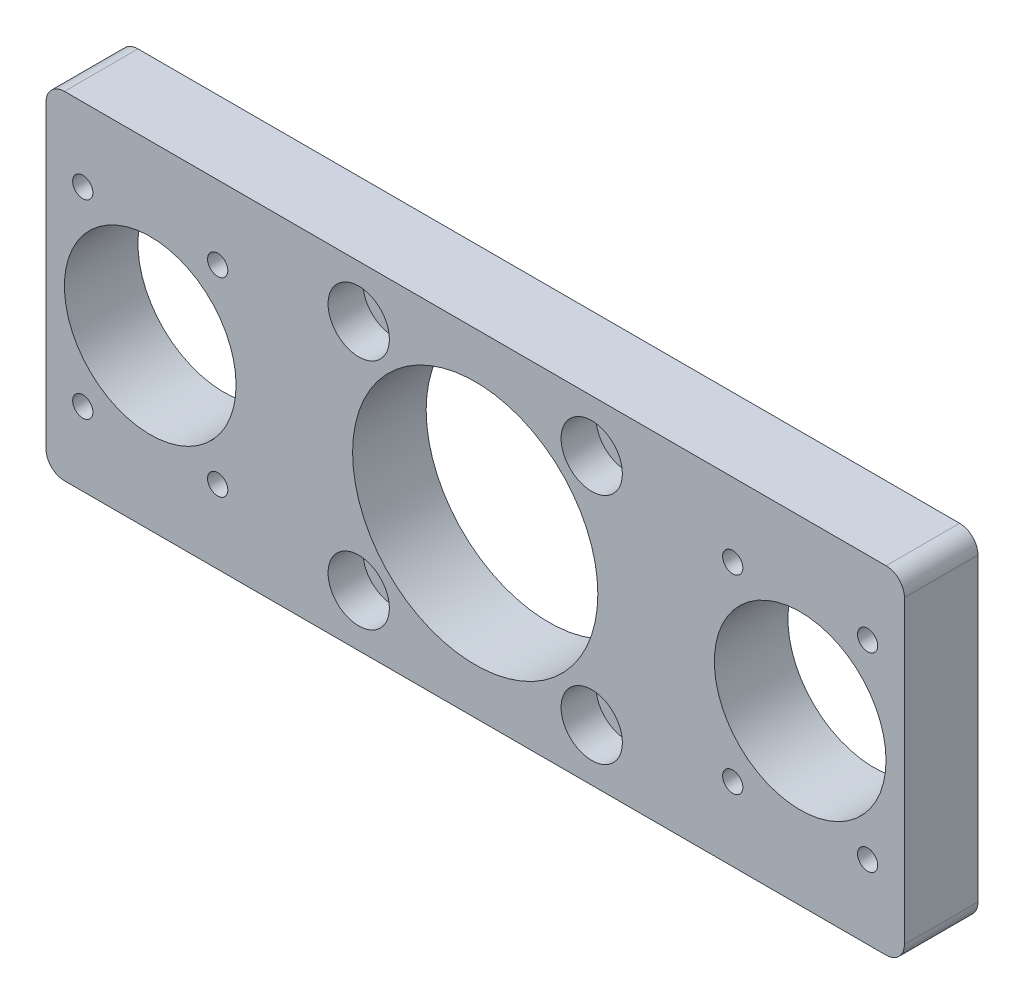
ISO-10303-21;
HEADER;
FILE_DESCRIPTION(('STEP AP214'),'2;1');
FILE_NAME('part.step','',(''),(''),'','','');
FILE_SCHEMA(('AUTOMOTIVE_DESIGN { 1 0 10303 214 1 1 1 1 }'));
ENDSEC;
DATA;
#1=APPLICATION_CONTEXT('core data for automotive mechanical design processes');
#2=APPLICATION_PROTOCOL_DEFINITION('international standard','automotive_design',2000,#1);
#3=PRODUCT_CONTEXT('',#1,'mechanical');
#4=PRODUCT('Part','Part','',(#3));
#5=PRODUCT_RELATED_PRODUCT_CATEGORY('part','',(#4));
#6=PRODUCT_DEFINITION_FORMATION('','',#4);
#7=PRODUCT_DEFINITION_CONTEXT('part definition',#1,'design');
#8=PRODUCT_DEFINITION('design','',#6,#7);
#9=PRODUCT_DEFINITION_SHAPE('','',#8);
#10=(LENGTH_UNIT() NAMED_UNIT(*) SI_UNIT(.MILLI.,.METRE.));
#11=(NAMED_UNIT(*) PLANE_ANGLE_UNIT() SI_UNIT($,.RADIAN.));
#12=(NAMED_UNIT(*) SI_UNIT($,.STERADIAN.) SOLID_ANGLE_UNIT());
#13=UNCERTAINTY_MEASURE_WITH_UNIT(LENGTH_MEASURE(1.E-05),#10,'distance_accuracy_value','');
#14=(GEOMETRIC_REPRESENTATION_CONTEXT(3) GLOBAL_UNCERTAINTY_ASSIGNED_CONTEXT((#13)) GLOBAL_UNIT_ASSIGNED_CONTEXT((#10,
#11,#12)) REPRESENTATION_CONTEXT('',''));
#15=CARTESIAN_POINT('',(0.,0.,0.));
#16=DIRECTION('',(0.,0.,1.));
#17=DIRECTION('',(1.,0.,0.));
#18=AXIS2_PLACEMENT_3D('',#15,#16,#17);
#19=CARTESIAN_POINT('',(0.,0.,12.));
#20=DIRECTION('',(0.,0.,-1.));
#21=DIRECTION('',(-1.,0.,0.));
#22=AXIS2_PLACEMENT_3D('',#19,#20,#21);
#23=PLANE('',#22);
#24=CARTESIAN_POINT('',(-19.,19.,12.));
#25=DIRECTION('',(0.,0.,1.));
#26=DIRECTION('',(1.,0.,0.));
#27=AXIS2_PLACEMENT_3D('',#24,#25,#26);
#28=CIRCLE('',#27,5.);
#29=CARTESIAN_POINT('',(-14.,19.,12.));
#30=VERTEX_POINT('',#29);
#31=EDGE_CURVE('E290',#30,#30,#28,.T.);
#32=ORIENTED_EDGE('',*,*,#31,.F.);
#33=EDGE_LOOP('',(#32));
#34=FACE_BOUND('',#33,.T.);
#35=CARTESIAN_POINT('',(19.,19.,12.));
#36=DIRECTION('',(0.,0.,1.));
#37=DIRECTION('',(1.,0.,0.));
#38=AXIS2_PLACEMENT_3D('',#35,#36,#37);
#39=CIRCLE('',#38,5.);
#40=CARTESIAN_POINT('',(24.,19.,12.));
#41=VERTEX_POINT('',#40);
#42=EDGE_CURVE('E278',#41,#41,#39,.T.);
#43=ORIENTED_EDGE('',*,*,#42,.F.);
#44=EDGE_LOOP('',(#43));
#45=FACE_BOUND('',#44,.T.);
#46=CARTESIAN_POINT('',(-64.,15.5,12.));
#47=DIRECTION('',(0.,0.,1.));
#48=DIRECTION('',(1.,0.,0.));
#49=AXIS2_PLACEMENT_3D('',#46,#47,#48);
#50=CIRCLE('',#49,1.65);
#51=CARTESIAN_POINT('',(-62.35,15.5,12.));
#52=VERTEX_POINT('',#51);
#53=EDGE_CURVE('E242',#52,#52,#50,.T.);
#54=ORIENTED_EDGE('',*,*,#53,.F.);
#55=EDGE_LOOP('',(#54));
#56=FACE_BOUND('',#55,.T.);
#57=CARTESIAN_POINT('',(-42.,15.5,12.));
#58=DIRECTION('',(0.,0.,1.));
#59=DIRECTION('',(1.,0.,0.));
#60=AXIS2_PLACEMENT_3D('',#57,#58,#59);
#61=CIRCLE('',#60,1.65);
#62=CARTESIAN_POINT('',(-40.35,15.5,12.));
#63=VERTEX_POINT('',#62);
#64=EDGE_CURVE('E236',#63,#63,#61,.T.);
#65=ORIENTED_EDGE('',*,*,#64,.F.);
#66=EDGE_LOOP('',(#65));
#67=FACE_BOUND('',#66,.T.);
#68=CARTESIAN_POINT('',(-42.,-15.5,12.));
#69=DIRECTION('',(0.,0.,1.));
#70=DIRECTION('',(1.,0.,0.));
#71=AXIS2_PLACEMENT_3D('',#68,#69,#70);
#72=CIRCLE('',#71,1.65);
#73=CARTESIAN_POINT('',(-40.35,-15.5,12.));
#74=VERTEX_POINT('',#73);
#75=EDGE_CURVE('E230',#74,#74,#72,.T.);
#76=ORIENTED_EDGE('',*,*,#75,.F.);
#77=EDGE_LOOP('',(#76));
#78=FACE_BOUND('',#77,.T.);
#79=CARTESIAN_POINT('',(-64.,-15.5,12.));
#80=DIRECTION('',(0.,0.,1.));
#81=DIRECTION('',(1.,0.,0.));
#82=AXIS2_PLACEMENT_3D('',#79,#80,#81);
#83=CIRCLE('',#82,1.65);
#84=CARTESIAN_POINT('',(-62.35,-15.5,12.));
#85=VERTEX_POINT('',#84);
#86=EDGE_CURVE('E224',#85,#85,#83,.T.);
#87=ORIENTED_EDGE('',*,*,#86,.F.);
#88=EDGE_LOOP('',(#87));
#89=FACE_BOUND('',#88,.T.);
#90=CARTESIAN_POINT('',(42.,-15.5,12.));
#91=DIRECTION('',(0.,0.,1.));
#92=DIRECTION('',(1.,0.,0.));
#93=AXIS2_PLACEMENT_3D('',#90,#91,#92);
#94=CIRCLE('',#93,1.65);
#95=CARTESIAN_POINT('',(43.65,-15.5,12.));
#96=VERTEX_POINT('',#95);
#97=EDGE_CURVE('E218',#96,#96,#94,.T.);
#98=ORIENTED_EDGE('',*,*,#97,.F.);
#99=EDGE_LOOP('',(#98));
#100=FACE_BOUND('',#99,.T.);
#101=CARTESIAN_POINT('',(64.,-15.5,12.));
#102=DIRECTION('',(0.,0.,1.));
#103=DIRECTION('',(1.,0.,0.));
#104=AXIS2_PLACEMENT_3D('',#101,#102,#103);
#105=CIRCLE('',#104,1.65);
#106=CARTESIAN_POINT('',(65.65,-15.5,12.));
#107=VERTEX_POINT('',#106);
#108=EDGE_CURVE('E212',#107,#107,#105,.T.);
#109=ORIENTED_EDGE('',*,*,#108,.F.);
#110=EDGE_LOOP('',(#109));
#111=FACE_BOUND('',#110,.T.);
#112=CARTESIAN_POINT('',(64.,15.5,12.));
#113=DIRECTION('',(0.,0.,1.));
#114=DIRECTION('',(1.,0.,0.));
#115=AXIS2_PLACEMENT_3D('',#112,#113,#114);
#116=CIRCLE('',#115,1.65);
#117=CARTESIAN_POINT('',(65.65,15.5,12.));
#118=VERTEX_POINT('',#117);
#119=EDGE_CURVE('E206',#118,#118,#116,.T.);
#120=ORIENTED_EDGE('',*,*,#119,.F.);
#121=EDGE_LOOP('',(#120));
#122=FACE_BOUND('',#121,.T.);
#123=CARTESIAN_POINT('',(53.,0.,12.));
#124=DIRECTION('',(0.,0.,1.));
#125=DIRECTION('',(1.,0.,0.));
#126=AXIS2_PLACEMENT_3D('',#123,#124,#125);
#127=CIRCLE('',#126,14.);
#128=CARTESIAN_POINT('',(67.,0.,12.));
#129=VERTEX_POINT('',#128);
#130=EDGE_CURVE('E186',#129,#129,#127,.T.);
#131=ORIENTED_EDGE('',*,*,#130,.F.);
#132=EDGE_LOOP('',(#131));
#133=FACE_BOUND('',#132,.T.);
#134=CARTESIAN_POINT('',(-53.,0.,12.));
#135=DIRECTION('',(0.,0.,1.));
#136=DIRECTION('',(1.,0.,0.));
#137=AXIS2_PLACEMENT_3D('',#134,#135,#136);
#138=CIRCLE('',#137,14.);
#139=CARTESIAN_POINT('',(-39.,0.,12.));
#140=VERTEX_POINT('',#139);
#141=EDGE_CURVE('E193',#140,#140,#138,.T.);
#142=ORIENTED_EDGE('',*,*,#141,.F.);
#143=EDGE_LOOP('',(#142));
#144=FACE_BOUND('',#143,.T.);
#145=CARTESIAN_POINT('',(0.,0.,12.));
#146=DIRECTION('',(0.,0.,1.));
#147=DIRECTION('',(1.,0.,0.));
#148=AXIS2_PLACEMENT_3D('',#145,#146,#147);
#149=CIRCLE('',#148,20.);
#150=CARTESIAN_POINT('',(20.,0.,12.));
#151=VERTEX_POINT('',#150);
#152=EDGE_CURVE('E180',#151,#151,#149,.T.);
#153=ORIENTED_EDGE('',*,*,#152,.F.);
#154=EDGE_LOOP('',(#153));
#155=FACE_BOUND('',#154,.T.);
#156=DIRECTION('',(0.,1.,0.));
#157=VECTOR('',#156,1.);
#158=CARTESIAN_POINT('',(70.,-27.5,12.));
#159=LINE('',#158,#157);
#160=CARTESIAN_POINT('',(70.,-24.5,12.));
#161=VERTEX_POINT('',#160);
#162=CARTESIAN_POINT('',(70.,24.5,12.));
#163=VERTEX_POINT('',#162);
#164=EDGE_CURVE('E140',#161,#163,#159,.T.);
#165=ORIENTED_EDGE('',*,*,#164,.T.);
#166=CARTESIAN_POINT('',(67.,24.5,12.));
#167=DIRECTION('',(0.,0.,-1.));
#168=DIRECTION('',(-1.,0.,0.));
#169=AXIS2_PLACEMENT_3D('',#166,#167,#168);
#170=CIRCLE('',#169,3.);
#171=CARTESIAN_POINT('',(67.,27.5,12.));
#172=VERTEX_POINT('',#171);
#173=EDGE_CURVE('E155',#163,#172,#170,.F.);
#174=ORIENTED_EDGE('',*,*,#173,.T.);
#175=DIRECTION('',(-1.,0.,0.));
#176=VECTOR('',#175,1.);
#177=CARTESIAN_POINT('',(-70.,27.5,12.));
#178=LINE('',#177,#176);
#179=CARTESIAN_POINT('',(-67.,27.5,12.));
#180=VERTEX_POINT('',#179);
#181=EDGE_CURVE('E122',#172,#180,#178,.T.);
#182=ORIENTED_EDGE('',*,*,#181,.T.);
#183=CARTESIAN_POINT('',(-67.,24.5,12.));
#184=DIRECTION('',(0.,0.,-1.));
#185=DIRECTION('',(-1.,0.,0.));
#186=AXIS2_PLACEMENT_3D('',#183,#184,#185);
#187=CIRCLE('',#186,3.);
#188=CARTESIAN_POINT('',(-70.,24.5,12.));
#189=VERTEX_POINT('',#188);
#190=EDGE_CURVE('E150',#180,#189,#187,.F.);
#191=ORIENTED_EDGE('',*,*,#190,.T.);
#192=DIRECTION('',(0.,-1.,0.));
#193=VECTOR('',#192,1.);
#194=CARTESIAN_POINT('',(-70.,-27.5,12.));
#195=LINE('',#194,#193);
#196=CARTESIAN_POINT('',(-70.,-24.5,12.));
#197=VERTEX_POINT('',#196);
#198=EDGE_CURVE('E166',#189,#197,#195,.T.);
#199=ORIENTED_EDGE('',*,*,#198,.T.);
#200=CARTESIAN_POINT('',(-67.,-24.5,12.));
#201=DIRECTION('',(0.,0.,-1.));
#202=DIRECTION('',(-1.,0.,0.));
#203=AXIS2_PLACEMENT_3D('',#200,#201,#202);
#204=CIRCLE('',#203,3.);
#205=CARTESIAN_POINT('',(-67.,-27.5,12.));
#206=VERTEX_POINT('',#205);
#207=EDGE_CURVE('E58',#197,#206,#204,.F.);
#208=ORIENTED_EDGE('',*,*,#207,.T.);
#209=DIRECTION('',(1.,0.,0.));
#210=VECTOR('',#209,1.);
#211=CARTESIAN_POINT('',(-70.,-27.5,12.));
#212=LINE('',#211,#210);
#213=CARTESIAN_POINT('',(67.,-27.5,12.));
#214=VERTEX_POINT('',#213);
#215=EDGE_CURVE('E141',#206,#214,#212,.T.);
#216=ORIENTED_EDGE('',*,*,#215,.T.);
#217=CARTESIAN_POINT('',(67.,-24.5,12.));
#218=DIRECTION('',(0.,0.,-1.));
#219=DIRECTION('',(-1.,0.,0.));
#220=AXIS2_PLACEMENT_3D('',#217,#218,#219);
#221=CIRCLE('',#220,3.);
#222=EDGE_CURVE('E153',#214,#161,#221,.F.);
#223=ORIENTED_EDGE('',*,*,#222,.T.);
#224=EDGE_LOOP('',(#165,#174,#182,#191,#199,#208,#216,#223));
#225=FACE_BOUND('',#224,.T.);
#226=CARTESIAN_POINT('',(42.,15.5,12.));
#227=DIRECTION('',(0.,0.,1.));
#228=DIRECTION('',(1.,0.,0.));
#229=AXIS2_PLACEMENT_3D('',#226,#227,#228);
#230=CIRCLE('',#229,1.65);
#231=CARTESIAN_POINT('',(43.65,15.5,12.));
#232=VERTEX_POINT('',#231);
#233=EDGE_CURVE('E200',#232,#232,#230,.T.);
#234=ORIENTED_EDGE('',*,*,#233,.F.);
#235=EDGE_LOOP('',(#234));
#236=FACE_BOUND('',#235,.T.);
#237=CARTESIAN_POINT('',(-19.,-19.,12.));
#238=DIRECTION('',(0.,0.,1.));
#239=DIRECTION('',(1.,0.,0.));
#240=AXIS2_PLACEMENT_3D('',#237,#238,#239);
#241=CIRCLE('',#240,5.);
#242=CARTESIAN_POINT('',(-14.,-19.,12.));
#243=VERTEX_POINT('',#242);
#244=EDGE_CURVE('E254',#243,#243,#241,.T.);
#245=ORIENTED_EDGE('',*,*,#244,.F.);
#246=EDGE_LOOP('',(#245));
#247=FACE_BOUND('',#246,.T.);
#248=CARTESIAN_POINT('',(19.,-19.,12.));
#249=DIRECTION('',(0.,0.,1.));
#250=DIRECTION('',(1.,0.,0.));
#251=AXIS2_PLACEMENT_3D('',#248,#249,#250);
#252=CIRCLE('',#251,5.);
#253=CARTESIAN_POINT('',(24.,-19.,12.));
#254=VERTEX_POINT('',#253);
#255=EDGE_CURVE('E266',#254,#254,#252,.T.);
#256=ORIENTED_EDGE('',*,*,#255,.F.);
#257=EDGE_LOOP('',(#256));
#258=FACE_BOUND('',#257,.T.);
#259=ADVANCED_FACE('F36',(#34,#45,#56,#67,#78,#89,#100,#111,#122,#133,#144,#155,#225,#236,#247,
#258),#23,.F.);
#260=CARTESIAN_POINT('',(0.,0.,0.));
#261=DIRECTION('',(0.,0.,-1.));
#262=DIRECTION('',(-1.,0.,0.));
#263=AXIS2_PLACEMENT_3D('',#260,#261,#262);
#264=PLANE('',#263);
#265=CARTESIAN_POINT('',(-19.,19.,0.));
#266=DIRECTION('',(0.,0.,1.));
#267=DIRECTION('',(1.,0.,0.));
#268=AXIS2_PLACEMENT_3D('',#265,#266,#267);
#269=CIRCLE('',#268,2.75);
#270=CARTESIAN_POINT('',(-16.25,19.,0.));
#271=VERTEX_POINT('',#270);
#272=EDGE_CURVE('E281',#271,#271,#269,.T.);
#273=ORIENTED_EDGE('',*,*,#272,.T.);
#274=EDGE_LOOP('',(#273));
#275=FACE_BOUND('',#274,.T.);
#276=CARTESIAN_POINT('',(19.,19.,0.));
#277=DIRECTION('',(0.,0.,1.));
#278=DIRECTION('',(1.,0.,0.));
#279=AXIS2_PLACEMENT_3D('',#276,#277,#278);
#280=CIRCLE('',#279,2.75);
#281=CARTESIAN_POINT('',(21.75,19.,0.));
#282=VERTEX_POINT('',#281);
#283=EDGE_CURVE('E269',#282,#282,#280,.T.);
#284=ORIENTED_EDGE('',*,*,#283,.T.);
#285=EDGE_LOOP('',(#284));
#286=FACE_BOUND('',#285,.T.);
#287=CARTESIAN_POINT('',(19.,-19.,0.));
#288=DIRECTION('',(0.,0.,1.));
#289=DIRECTION('',(1.,0.,0.));
#290=AXIS2_PLACEMENT_3D('',#287,#288,#289);
#291=CIRCLE('',#290,2.75);
#292=CARTESIAN_POINT('',(21.75,-19.,0.));
#293=VERTEX_POINT('',#292);
#294=EDGE_CURVE('E257',#293,#293,#291,.T.);
#295=ORIENTED_EDGE('',*,*,#294,.T.);
#296=EDGE_LOOP('',(#295));
#297=FACE_BOUND('',#296,.T.);
#298=CARTESIAN_POINT('',(42.,15.5,0.));
#299=DIRECTION('',(0.,0.,1.));
#300=DIRECTION('',(1.,0.,0.));
#301=AXIS2_PLACEMENT_3D('',#298,#299,#300);
#302=CIRCLE('',#301,1.65);
#303=CARTESIAN_POINT('',(43.65,15.5,0.));
#304=VERTEX_POINT('',#303);
#305=EDGE_CURVE('E190',#304,#304,#302,.T.);
#306=ORIENTED_EDGE('',*,*,#305,.T.);
#307=EDGE_LOOP('',(#306));
#308=FACE_BOUND('',#307,.T.);
#309=CARTESIAN_POINT('',(53.,0.,0.));
#310=DIRECTION('',(0.,0.,1.));
#311=DIRECTION('',(1.,0.,0.));
#312=AXIS2_PLACEMENT_3D('',#309,#310,#311);
#313=CIRCLE('',#312,14.);
#314=CARTESIAN_POINT('',(67.,0.,0.));
#315=VERTEX_POINT('',#314);
#316=EDGE_CURVE('E189',#315,#315,#313,.T.);
#317=ORIENTED_EDGE('',*,*,#316,.T.);
#318=EDGE_LOOP('',(#317));
#319=FACE_BOUND('',#318,.T.);
#320=CARTESIAN_POINT('',(-53.,0.,0.));
#321=DIRECTION('',(0.,0.,1.));
#322=DIRECTION('',(1.,0.,0.));
#323=AXIS2_PLACEMENT_3D('',#320,#321,#322);
#324=CIRCLE('',#323,14.);
#325=CARTESIAN_POINT('',(-39.,0.,0.));
#326=VERTEX_POINT('',#325);
#327=EDGE_CURVE('E183',#326,#326,#324,.T.);
#328=ORIENTED_EDGE('',*,*,#327,.T.);
#329=EDGE_LOOP('',(#328));
#330=FACE_BOUND('',#329,.T.);
#331=CARTESIAN_POINT('',(0.,0.,0.));
#332=DIRECTION('',(0.,0.,1.));
#333=DIRECTION('',(1.,0.,0.));
#334=AXIS2_PLACEMENT_3D('',#331,#332,#333);
#335=CIRCLE('',#334,20.);
#336=CARTESIAN_POINT('',(20.,0.,0.));
#337=VERTEX_POINT('',#336);
#338=EDGE_CURVE('E135',#337,#337,#335,.T.);
#339=ORIENTED_EDGE('',*,*,#338,.T.);
#340=EDGE_LOOP('',(#339));
#341=FACE_BOUND('',#340,.T.);
#342=DIRECTION('',(-1.,0.,0.));
#343=VECTOR('',#342,1.);
#344=CARTESIAN_POINT('',(-70.,27.5,0.));
#345=LINE('',#344,#343);
#346=CARTESIAN_POINT('',(67.,27.5,0.));
#347=VERTEX_POINT('',#346);
#348=CARTESIAN_POINT('',(-67.,27.5,0.));
#349=VERTEX_POINT('',#348);
#350=EDGE_CURVE('E119',#347,#349,#345,.T.);
#351=ORIENTED_EDGE('',*,*,#350,.F.);
#352=CARTESIAN_POINT('',(67.,24.5,0.));
#353=DIRECTION('',(0.,0.,-1.));
#354=DIRECTION('',(-1.,0.,0.));
#355=AXIS2_PLACEMENT_3D('',#352,#353,#354);
#356=CIRCLE('',#355,3.);
#357=CARTESIAN_POINT('',(70.,24.5,0.));
#358=VERTEX_POINT('',#357);
#359=EDGE_CURVE('E102',#347,#358,#356,.T.);
#360=ORIENTED_EDGE('',*,*,#359,.T.);
#361=DIRECTION('',(0.,1.,0.));
#362=VECTOR('',#361,1.);
#363=CARTESIAN_POINT('',(70.,-27.5,0.));
#364=LINE('',#363,#362);
#365=CARTESIAN_POINT('',(70.,-24.5,0.));
#366=VERTEX_POINT('',#365);
#367=EDGE_CURVE('E130',#366,#358,#364,.T.);
#368=ORIENTED_EDGE('',*,*,#367,.F.);
#369=CARTESIAN_POINT('',(67.,-24.5,0.));
#370=DIRECTION('',(0.,0.,-1.));
#371=DIRECTION('',(-1.,0.,0.));
#372=AXIS2_PLACEMENT_3D('',#369,#370,#371);
#373=CIRCLE('',#372,3.);
#374=CARTESIAN_POINT('',(67.,-27.5,0.));
#375=VERTEX_POINT('',#374);
#376=EDGE_CURVE('E113',#366,#375,#373,.T.);
#377=ORIENTED_EDGE('',*,*,#376,.T.);
#378=DIRECTION('',(1.,0.,0.));
#379=VECTOR('',#378,1.);
#380=CARTESIAN_POINT('',(-70.,-27.5,0.));
#381=LINE('',#380,#379);
#382=CARTESIAN_POINT('',(-67.,-27.5,0.));
#383=VERTEX_POINT('',#382);
#384=EDGE_CURVE('E133',#383,#375,#381,.T.);
#385=ORIENTED_EDGE('',*,*,#384,.F.);
#386=CARTESIAN_POINT('',(-67.,-24.5,0.));
#387=DIRECTION('',(0.,0.,-1.));
#388=DIRECTION('',(-1.,0.,0.));
#389=AXIS2_PLACEMENT_3D('',#386,#387,#388);
#390=CIRCLE('',#389,3.);
#391=CARTESIAN_POINT('',(-70.,-24.5,0.));
#392=VERTEX_POINT('',#391);
#393=EDGE_CURVE('E144',#383,#392,#390,.T.);
#394=ORIENTED_EDGE('',*,*,#393,.T.);
#395=DIRECTION('',(0.,-1.,0.));
#396=VECTOR('',#395,1.);
#397=CARTESIAN_POINT('',(-70.,-27.5,0.));
#398=LINE('',#397,#396);
#399=CARTESIAN_POINT('',(-70.,24.5,0.));
#400=VERTEX_POINT('',#399);
#401=EDGE_CURVE('E129',#400,#392,#398,.T.);
#402=ORIENTED_EDGE('',*,*,#401,.F.);
#403=CARTESIAN_POINT('',(-67.,24.5,0.));
#404=DIRECTION('',(0.,0.,-1.));
#405=DIRECTION('',(-1.,0.,0.));
#406=AXIS2_PLACEMENT_3D('',#403,#404,#405);
#407=CIRCLE('',#406,3.);
#408=EDGE_CURVE('E123',#400,#349,#407,.T.);
#409=ORIENTED_EDGE('',*,*,#408,.T.);
#410=EDGE_LOOP('',(#351,#360,#368,#377,#385,#394,#402,#409));
#411=FACE_BOUND('',#410,.T.);
#412=CARTESIAN_POINT('',(64.,15.5,0.));
#413=DIRECTION('',(0.,0.,1.));
#414=DIRECTION('',(1.,0.,0.));
#415=AXIS2_PLACEMENT_3D('',#412,#413,#414);
#416=CIRCLE('',#415,1.65);
#417=CARTESIAN_POINT('',(65.65,15.5,0.));
#418=VERTEX_POINT('',#417);
#419=EDGE_CURVE('E203',#418,#418,#416,.T.);
#420=ORIENTED_EDGE('',*,*,#419,.T.);
#421=EDGE_LOOP('',(#420));
#422=FACE_BOUND('',#421,.T.);
#423=CARTESIAN_POINT('',(64.,-15.5,0.));
#424=DIRECTION('',(0.,0.,1.));
#425=DIRECTION('',(1.,0.,0.));
#426=AXIS2_PLACEMENT_3D('',#423,#424,#425);
#427=CIRCLE('',#426,1.65);
#428=CARTESIAN_POINT('',(65.65,-15.5,0.));
#429=VERTEX_POINT('',#428);
#430=EDGE_CURVE('E209',#429,#429,#427,.T.);
#431=ORIENTED_EDGE('',*,*,#430,.T.);
#432=EDGE_LOOP('',(#431));
#433=FACE_BOUND('',#432,.T.);
#434=CARTESIAN_POINT('',(42.,-15.5,0.));
#435=DIRECTION('',(0.,0.,1.));
#436=DIRECTION('',(1.,0.,0.));
#437=AXIS2_PLACEMENT_3D('',#434,#435,#436);
#438=CIRCLE('',#437,1.65);
#439=CARTESIAN_POINT('',(43.65,-15.5,0.));
#440=VERTEX_POINT('',#439);
#441=EDGE_CURVE('E215',#440,#440,#438,.T.);
#442=ORIENTED_EDGE('',*,*,#441,.T.);
#443=EDGE_LOOP('',(#442));
#444=FACE_BOUND('',#443,.T.);
#445=CARTESIAN_POINT('',(-64.,-15.5,0.));
#446=DIRECTION('',(0.,0.,1.));
#447=DIRECTION('',(1.,0.,0.));
#448=AXIS2_PLACEMENT_3D('',#445,#446,#447);
#449=CIRCLE('',#448,1.65);
#450=CARTESIAN_POINT('',(-62.35,-15.5,0.));
#451=VERTEX_POINT('',#450);
#452=EDGE_CURVE('E221',#451,#451,#449,.T.);
#453=ORIENTED_EDGE('',*,*,#452,.T.);
#454=EDGE_LOOP('',(#453));
#455=FACE_BOUND('',#454,.T.);
#456=CARTESIAN_POINT('',(-42.,-15.5,0.));
#457=DIRECTION('',(0.,0.,1.));
#458=DIRECTION('',(1.,0.,0.));
#459=AXIS2_PLACEMENT_3D('',#456,#457,#458);
#460=CIRCLE('',#459,1.65);
#461=CARTESIAN_POINT('',(-40.35,-15.5,0.));
#462=VERTEX_POINT('',#461);
#463=EDGE_CURVE('E227',#462,#462,#460,.T.);
#464=ORIENTED_EDGE('',*,*,#463,.T.);
#465=EDGE_LOOP('',(#464));
#466=FACE_BOUND('',#465,.T.);
#467=CARTESIAN_POINT('',(-42.,15.5,0.));
#468=DIRECTION('',(0.,0.,1.));
#469=DIRECTION('',(1.,0.,0.));
#470=AXIS2_PLACEMENT_3D('',#467,#468,#469);
#471=CIRCLE('',#470,1.65);
#472=CARTESIAN_POINT('',(-40.35,15.5,0.));
#473=VERTEX_POINT('',#472);
#474=EDGE_CURVE('E233',#473,#473,#471,.T.);
#475=ORIENTED_EDGE('',*,*,#474,.T.);
#476=EDGE_LOOP('',(#475));
#477=FACE_BOUND('',#476,.T.);
#478=CARTESIAN_POINT('',(-64.,15.5,0.));
#479=DIRECTION('',(0.,0.,1.));
#480=DIRECTION('',(1.,0.,0.));
#481=AXIS2_PLACEMENT_3D('',#478,#479,#480);
#482=CIRCLE('',#481,1.65);
#483=CARTESIAN_POINT('',(-62.35,15.5,0.));
#484=VERTEX_POINT('',#483);
#485=EDGE_CURVE('E239',#484,#484,#482,.T.);
#486=ORIENTED_EDGE('',*,*,#485,.T.);
#487=EDGE_LOOP('',(#486));
#488=FACE_BOUND('',#487,.T.);
#489=CARTESIAN_POINT('',(-19.,-19.,0.));
#490=DIRECTION('',(0.,0.,1.));
#491=DIRECTION('',(1.,0.,0.));
#492=AXIS2_PLACEMENT_3D('',#489,#490,#491);
#493=CIRCLE('',#492,2.75);
#494=CARTESIAN_POINT('',(-16.25,-19.,0.));
#495=VERTEX_POINT('',#494);
#496=EDGE_CURVE('E245',#495,#495,#493,.T.);
#497=ORIENTED_EDGE('',*,*,#496,.T.);
#498=EDGE_LOOP('',(#497));
#499=FACE_BOUND('',#498,.T.);
#500=ADVANCED_FACE('F126',(#275,#286,#297,#308,#319,#330,#341,#411,#422,#433,#444,#455,#466,
#477,#488,#499),#264,.T.);
#501=CARTESIAN_POINT('',(70.,-27.5,12.));
#502=DIRECTION('',(-1.,0.,0.));
#503=DIRECTION('',(0.,0.,1.));
#504=AXIS2_PLACEMENT_3D('',#501,#502,#503);
#505=PLANE('',#504);
#506=ORIENTED_EDGE('',*,*,#367,.T.);
#507=DIRECTION('',(0.,0.,-1.));
#508=VECTOR('',#507,1.);
#509=CARTESIAN_POINT('',(70.,24.5,12.));
#510=LINE('',#509,#508);
#511=EDGE_CURVE('E107',#358,#163,#510,.F.);
#512=ORIENTED_EDGE('',*,*,#511,.T.);
#513=ORIENTED_EDGE('',*,*,#164,.F.);
#514=DIRECTION('',(0.,0.,-1.));
#515=VECTOR('',#514,1.);
#516=CARTESIAN_POINT('',(70.,-24.5,12.));
#517=LINE('',#516,#515);
#518=EDGE_CURVE('E112',#161,#366,#517,.T.);
#519=ORIENTED_EDGE('',*,*,#518,.T.);
#520=EDGE_LOOP('',(#506,#512,#513,#519));
#521=FACE_BOUND('',#520,.T.);
#522=ADVANCED_FACE('F408',(#521),#505,.F.);
#523=CARTESIAN_POINT('',(-70.,27.5,12.));
#524=DIRECTION('',(0.,-1.,0.));
#525=DIRECTION('',(0.,0.,-1.));
#526=AXIS2_PLACEMENT_3D('',#523,#524,#525);
#527=PLANE('',#526);
#528=ORIENTED_EDGE('',*,*,#181,.F.);
#529=DIRECTION('',(0.,0.,-1.));
#530=VECTOR('',#529,1.);
#531=CARTESIAN_POINT('',(67.,27.5,12.));
#532=LINE('',#531,#530);
#533=EDGE_CURVE('E106',#172,#347,#532,.T.);
#534=ORIENTED_EDGE('',*,*,#533,.T.);
#535=ORIENTED_EDGE('',*,*,#350,.T.);
#536=DIRECTION('',(0.,0.,-1.));
#537=VECTOR('',#536,1.);
#538=CARTESIAN_POINT('',(-67.,27.5,12.));
#539=LINE('',#538,#537);
#540=EDGE_CURVE('E124',#349,#180,#539,.F.);
#541=ORIENTED_EDGE('',*,*,#540,.T.);
#542=EDGE_LOOP('',(#528,#534,#535,#541));
#543=FACE_BOUND('',#542,.T.);
#544=ADVANCED_FACE('F118',(#543),#527,.F.);
#545=CARTESIAN_POINT('',(-70.,-27.5,12.));
#546=DIRECTION('',(1.,0.,0.));
#547=DIRECTION('',(0.,0.,-1.));
#548=AXIS2_PLACEMENT_3D('',#545,#546,#547);
#549=PLANE('',#548);
#550=ORIENTED_EDGE('',*,*,#401,.T.);
#551=DIRECTION('',(0.,0.,-1.));
#552=VECTOR('',#551,1.);
#553=CARTESIAN_POINT('',(-70.,-24.5,12.));
#554=LINE('',#553,#552);
#555=EDGE_CURVE('E11',#392,#197,#554,.F.);
#556=ORIENTED_EDGE('',*,*,#555,.T.);
#557=ORIENTED_EDGE('',*,*,#198,.F.);
#558=DIRECTION('',(0.,0.,-1.));
#559=VECTOR('',#558,1.);
#560=CARTESIAN_POINT('',(-70.,24.5,12.));
#561=LINE('',#560,#559);
#562=EDGE_CURVE('E44',#189,#400,#561,.T.);
#563=ORIENTED_EDGE('',*,*,#562,.T.);
#564=EDGE_LOOP('',(#550,#556,#557,#563));
#565=FACE_BOUND('',#564,.T.);
#566=ADVANCED_FACE('F164',(#565),#549,.F.);
#567=CARTESIAN_POINT('',(-70.,-27.5,12.));
#568=DIRECTION('',(0.,1.,0.));
#569=DIRECTION('',(0.,0.,1.));
#570=AXIS2_PLACEMENT_3D('',#567,#568,#569);
#571=PLANE('',#570);
#572=ORIENTED_EDGE('',*,*,#384,.T.);
#573=DIRECTION('',(0.,0.,-1.));
#574=VECTOR('',#573,1.);
#575=CARTESIAN_POINT('',(67.,-27.5,12.));
#576=LINE('',#575,#574);
#577=EDGE_CURVE('E51',#375,#214,#576,.F.);
#578=ORIENTED_EDGE('',*,*,#577,.T.);
#579=ORIENTED_EDGE('',*,*,#215,.F.);
#580=DIRECTION('',(0.,0.,-1.));
#581=VECTOR('',#580,1.);
#582=CARTESIAN_POINT('',(-67.,-27.5,12.));
#583=LINE('',#582,#581);
#584=EDGE_CURVE('E157',#206,#383,#583,.T.);
#585=ORIENTED_EDGE('',*,*,#584,.T.);
#586=EDGE_LOOP('',(#572,#578,#579,#585));
#587=FACE_BOUND('',#586,.T.);
#588=ADVANCED_FACE('F173',(#587),#571,.F.);
#589=CARTESIAN_POINT('',(0.,0.,0.));
#590=DIRECTION('',(0.,0.,1.));
#591=DIRECTION('',(1.,0.,0.));
#592=AXIS2_PLACEMENT_3D('',#589,#590,#591);
#593=CYLINDRICAL_SURFACE('',#592,20.);
#594=ORIENTED_EDGE('',*,*,#338,.F.);
#595=EDGE_LOOP('',(#594));
#596=FACE_BOUND('',#595,.T.);
#597=ORIENTED_EDGE('',*,*,#152,.T.);
#598=EDGE_LOOP('',(#597));
#599=FACE_BOUND('',#598,.T.);
#600=ADVANCED_FACE('F398',(#596,#599),#593,.F.);
#601=CARTESIAN_POINT('',(-53.,0.,0.));
#602=DIRECTION('',(0.,0.,1.));
#603=DIRECTION('',(1.,0.,0.));
#604=AXIS2_PLACEMENT_3D('',#601,#602,#603);
#605=CYLINDRICAL_SURFACE('',#604,14.);
#606=ORIENTED_EDGE('',*,*,#327,.F.);
#607=EDGE_LOOP('',(#606));
#608=FACE_BOUND('',#607,.T.);
#609=ORIENTED_EDGE('',*,*,#141,.T.);
#610=EDGE_LOOP('',(#609));
#611=FACE_BOUND('',#610,.T.);
#612=ADVANCED_FACE('F394',(#608,#611),#605,.F.);
#613=CARTESIAN_POINT('',(53.,0.,0.));
#614=DIRECTION('',(0.,0.,1.));
#615=DIRECTION('',(1.,0.,0.));
#616=AXIS2_PLACEMENT_3D('',#613,#614,#615);
#617=CYLINDRICAL_SURFACE('',#616,14.);
#618=ORIENTED_EDGE('',*,*,#316,.F.);
#619=EDGE_LOOP('',(#618));
#620=FACE_BOUND('',#619,.T.);
#621=ORIENTED_EDGE('',*,*,#130,.T.);
#622=EDGE_LOOP('',(#621));
#623=FACE_BOUND('',#622,.T.);
#624=ADVANCED_FACE('F397',(#620,#623),#617,.F.);
#625=CARTESIAN_POINT('',(67.,24.5,12.));
#626=DIRECTION('',(0.,0.,-1.));
#627=DIRECTION('',(-1.,0.,0.));
#628=AXIS2_PLACEMENT_3D('',#625,#626,#627);
#629=CYLINDRICAL_SURFACE('',#628,3.);
#630=ORIENTED_EDGE('',*,*,#173,.F.);
#631=ORIENTED_EDGE('',*,*,#511,.F.);
#632=ORIENTED_EDGE('',*,*,#359,.F.);
#633=ORIENTED_EDGE('',*,*,#533,.F.);
#634=EDGE_LOOP('',(#630,#631,#632,#633));
#635=FACE_BOUND('',#634,.T.);
#636=ADVANCED_FACE('F105',(#635),#629,.T.);
#637=CARTESIAN_POINT('',(67.,-24.5,12.));
#638=DIRECTION('',(0.,0.,-1.));
#639=DIRECTION('',(-1.,0.,0.));
#640=AXIS2_PLACEMENT_3D('',#637,#638,#639);
#641=CYLINDRICAL_SURFACE('',#640,3.);
#642=ORIENTED_EDGE('',*,*,#222,.F.);
#643=ORIENTED_EDGE('',*,*,#577,.F.);
#644=ORIENTED_EDGE('',*,*,#376,.F.);
#645=ORIENTED_EDGE('',*,*,#518,.F.);
#646=EDGE_LOOP('',(#642,#643,#644,#645));
#647=FACE_BOUND('',#646,.T.);
#648=ADVANCED_FACE('F421',(#647),#641,.T.);
#649=CARTESIAN_POINT('',(-67.,-24.5,12.));
#650=DIRECTION('',(0.,0.,-1.));
#651=DIRECTION('',(-1.,0.,0.));
#652=AXIS2_PLACEMENT_3D('',#649,#650,#651);
#653=CYLINDRICAL_SURFACE('',#652,3.);
#654=ORIENTED_EDGE('',*,*,#207,.F.);
#655=ORIENTED_EDGE('',*,*,#555,.F.);
#656=ORIENTED_EDGE('',*,*,#393,.F.);
#657=ORIENTED_EDGE('',*,*,#584,.F.);
#658=EDGE_LOOP('',(#654,#655,#656,#657));
#659=FACE_BOUND('',#658,.T.);
#660=ADVANCED_FACE('F172',(#659),#653,.T.);
#661=CARTESIAN_POINT('',(-67.,24.5,12.));
#662=DIRECTION('',(0.,0.,-1.));
#663=DIRECTION('',(-1.,0.,0.));
#664=AXIS2_PLACEMENT_3D('',#661,#662,#663);
#665=CYLINDRICAL_SURFACE('',#664,3.);
#666=ORIENTED_EDGE('',*,*,#190,.F.);
#667=ORIENTED_EDGE('',*,*,#540,.F.);
#668=ORIENTED_EDGE('',*,*,#408,.F.);
#669=ORIENTED_EDGE('',*,*,#562,.F.);
#670=EDGE_LOOP('',(#666,#667,#668,#669));
#671=FACE_BOUND('',#670,.T.);
#672=ADVANCED_FACE('F38',(#671),#665,.T.);
#673=CARTESIAN_POINT('',(42.,15.5,12.));
#674=DIRECTION('',(0.,0.,1.));
#675=DIRECTION('',(1.,0.,0.));
#676=AXIS2_PLACEMENT_3D('',#673,#674,#675);
#677=CYLINDRICAL_SURFACE('',#676,1.65);
#678=ORIENTED_EDGE('',*,*,#305,.F.);
#679=EDGE_LOOP('',(#678));
#680=FACE_BOUND('',#679,.T.);
#681=ORIENTED_EDGE('',*,*,#233,.T.);
#682=EDGE_LOOP('',(#681));
#683=FACE_BOUND('',#682,.T.);
#684=ADVANCED_FACE('F389',(#680,#683),#677,.F.);
#685=CARTESIAN_POINT('',(64.,15.5,12.));
#686=DIRECTION('',(0.,0.,1.));
#687=DIRECTION('',(1.,0.,0.));
#688=AXIS2_PLACEMENT_3D('',#685,#686,#687);
#689=CYLINDRICAL_SURFACE('',#688,1.65);
#690=ORIENTED_EDGE('',*,*,#419,.F.);
#691=EDGE_LOOP('',(#690));
#692=FACE_BOUND('',#691,.T.);
#693=ORIENTED_EDGE('',*,*,#119,.T.);
#694=EDGE_LOOP('',(#693));
#695=FACE_BOUND('',#694,.T.);
#696=ADVANCED_FACE('F385',(#692,#695),#689,.F.);
#697=CARTESIAN_POINT('',(64.,-15.5,12.));
#698=DIRECTION('',(0.,0.,1.));
#699=DIRECTION('',(1.,0.,0.));
#700=AXIS2_PLACEMENT_3D('',#697,#698,#699);
#701=CYLINDRICAL_SURFACE('',#700,1.65);
#702=ORIENTED_EDGE('',*,*,#430,.F.);
#703=EDGE_LOOP('',(#702));
#704=FACE_BOUND('',#703,.T.);
#705=ORIENTED_EDGE('',*,*,#108,.T.);
#706=EDGE_LOOP('',(#705));
#707=FACE_BOUND('',#706,.T.);
#708=ADVANCED_FACE('F381',(#704,#707),#701,.F.);
#709=CARTESIAN_POINT('',(42.,-15.5,12.));
#710=DIRECTION('',(0.,0.,1.));
#711=DIRECTION('',(1.,0.,0.));
#712=AXIS2_PLACEMENT_3D('',#709,#710,#711);
#713=CYLINDRICAL_SURFACE('',#712,1.65);
#714=ORIENTED_EDGE('',*,*,#441,.F.);
#715=EDGE_LOOP('',(#714));
#716=FACE_BOUND('',#715,.T.);
#717=ORIENTED_EDGE('',*,*,#97,.T.);
#718=EDGE_LOOP('',(#717));
#719=FACE_BOUND('',#718,.T.);
#720=ADVANCED_FACE('F377',(#716,#719),#713,.F.);
#721=CARTESIAN_POINT('',(-64.,-15.5,12.));
#722=DIRECTION('',(0.,0.,1.));
#723=DIRECTION('',(1.,0.,0.));
#724=AXIS2_PLACEMENT_3D('',#721,#722,#723);
#725=CYLINDRICAL_SURFACE('',#724,1.65);
#726=ORIENTED_EDGE('',*,*,#452,.F.);
#727=EDGE_LOOP('',(#726));
#728=FACE_BOUND('',#727,.T.);
#729=ORIENTED_EDGE('',*,*,#86,.T.);
#730=EDGE_LOOP('',(#729));
#731=FACE_BOUND('',#730,.T.);
#732=ADVANCED_FACE('F373',(#728,#731),#725,.F.);
#733=CARTESIAN_POINT('',(-42.,-15.5,12.));
#734=DIRECTION('',(0.,0.,1.));
#735=DIRECTION('',(1.,0.,0.));
#736=AXIS2_PLACEMENT_3D('',#733,#734,#735);
#737=CYLINDRICAL_SURFACE('',#736,1.65);
#738=ORIENTED_EDGE('',*,*,#463,.F.);
#739=EDGE_LOOP('',(#738));
#740=FACE_BOUND('',#739,.T.);
#741=ORIENTED_EDGE('',*,*,#75,.T.);
#742=EDGE_LOOP('',(#741));
#743=FACE_BOUND('',#742,.T.);
#744=ADVANCED_FACE('F369',(#740,#743),#737,.F.);
#745=CARTESIAN_POINT('',(-42.,15.5,12.));
#746=DIRECTION('',(0.,0.,1.));
#747=DIRECTION('',(1.,0.,0.));
#748=AXIS2_PLACEMENT_3D('',#745,#746,#747);
#749=CYLINDRICAL_SURFACE('',#748,1.65);
#750=ORIENTED_EDGE('',*,*,#474,.F.);
#751=EDGE_LOOP('',(#750));
#752=FACE_BOUND('',#751,.T.);
#753=ORIENTED_EDGE('',*,*,#64,.T.);
#754=EDGE_LOOP('',(#753));
#755=FACE_BOUND('',#754,.T.);
#756=ADVANCED_FACE('F365',(#752,#755),#749,.F.);
#757=CARTESIAN_POINT('',(-64.,15.5,12.));
#758=DIRECTION('',(0.,0.,1.));
#759=DIRECTION('',(1.,0.,0.));
#760=AXIS2_PLACEMENT_3D('',#757,#758,#759);
#761=CYLINDRICAL_SURFACE('',#760,1.65);
#762=ORIENTED_EDGE('',*,*,#485,.F.);
#763=EDGE_LOOP('',(#762));
#764=FACE_BOUND('',#763,.T.);
#765=ORIENTED_EDGE('',*,*,#53,.T.);
#766=EDGE_LOOP('',(#765));
#767=FACE_BOUND('',#766,.T.);
#768=ADVANCED_FACE('F361',(#764,#767),#761,.F.);
#769=CARTESIAN_POINT('',(-19.,-19.,12.));
#770=DIRECTION('',(0.,0.,1.));
#771=DIRECTION('',(1.,0.,0.));
#772=AXIS2_PLACEMENT_3D('',#769,#770,#771);
#773=CYLINDRICAL_SURFACE('',#772,2.75);
#774=ORIENTED_EDGE('',*,*,#496,.F.);
#775=EDGE_LOOP('',(#774));
#776=FACE_BOUND('',#775,.T.);
#777=CARTESIAN_POINT('',(-19.,-19.,6.3));
#778=DIRECTION('',(0.,0.,1.));
#779=DIRECTION('',(1.,0.,0.));
#780=AXIS2_PLACEMENT_3D('',#777,#778,#779);
#781=CIRCLE('',#780,2.75);
#782=CARTESIAN_POINT('',(-16.25,-19.,6.3));
#783=VERTEX_POINT('',#782);
#784=EDGE_CURVE('E248',#783,#783,#781,.T.);
#785=ORIENTED_EDGE('',*,*,#784,.T.);
#786=EDGE_LOOP('',(#785));
#787=FACE_BOUND('',#786,.T.);
#788=ADVANCED_FACE('F357',(#776,#787),#773,.F.);
#789=CARTESIAN_POINT('',(-16.25,-19.,6.3));
#790=DIRECTION('',(0.,0.,-1.));
#791=DIRECTION('',(-1.,0.,0.));
#792=AXIS2_PLACEMENT_3D('',#789,#790,#791);
#793=PLANE('',#792);
#794=ORIENTED_EDGE('',*,*,#784,.F.);
#795=EDGE_LOOP('',(#794));
#796=FACE_BOUND('',#795,.T.);
#797=CARTESIAN_POINT('',(-19.,-19.,6.3));
#798=DIRECTION('',(0.,0.,1.));
#799=DIRECTION('',(1.,0.,0.));
#800=AXIS2_PLACEMENT_3D('',#797,#798,#799);
#801=CIRCLE('',#800,5.);
#802=CARTESIAN_POINT('',(-14.,-19.,6.3));
#803=VERTEX_POINT('',#802);
#804=EDGE_CURVE('E251',#803,#803,#801,.T.);
#805=ORIENTED_EDGE('',*,*,#804,.T.);
#806=EDGE_LOOP('',(#805));
#807=FACE_BOUND('',#806,.T.);
#808=ADVANCED_FACE('F353',(#796,#807),#793,.F.);
#809=CARTESIAN_POINT('',(-19.,-19.,12.));
#810=DIRECTION('',(0.,0.,1.));
#811=DIRECTION('',(1.,0.,0.));
#812=AXIS2_PLACEMENT_3D('',#809,#810,#811);
#813=CYLINDRICAL_SURFACE('',#812,5.);
#814=ORIENTED_EDGE('',*,*,#804,.F.);
#815=EDGE_LOOP('',(#814));
#816=FACE_BOUND('',#815,.T.);
#817=ORIENTED_EDGE('',*,*,#244,.T.);
#818=EDGE_LOOP('',(#817));
#819=FACE_BOUND('',#818,.T.);
#820=ADVANCED_FACE('F349',(#816,#819),#813,.F.);
#821=CARTESIAN_POINT('',(19.,-19.,12.));
#822=DIRECTION('',(0.,0.,1.));
#823=DIRECTION('',(1.,0.,0.));
#824=AXIS2_PLACEMENT_3D('',#821,#822,#823);
#825=CYLINDRICAL_SURFACE('',#824,2.75);
#826=ORIENTED_EDGE('',*,*,#294,.F.);
#827=EDGE_LOOP('',(#826));
#828=FACE_BOUND('',#827,.T.);
#829=CARTESIAN_POINT('',(19.,-19.,6.3));
#830=DIRECTION('',(0.,0.,1.));
#831=DIRECTION('',(1.,0.,0.));
#832=AXIS2_PLACEMENT_3D('',#829,#830,#831);
#833=CIRCLE('',#832,2.75);
#834=CARTESIAN_POINT('',(21.75,-19.,6.3));
#835=VERTEX_POINT('',#834);
#836=EDGE_CURVE('E260',#835,#835,#833,.T.);
#837=ORIENTED_EDGE('',*,*,#836,.T.);
#838=EDGE_LOOP('',(#837));
#839=FACE_BOUND('',#838,.T.);
#840=ADVANCED_FACE('F341',(#828,#839),#825,.F.);
#841=CARTESIAN_POINT('',(21.75,-19.,6.3));
#842=DIRECTION('',(0.,0.,-1.));
#843=DIRECTION('',(-1.,0.,0.));
#844=AXIS2_PLACEMENT_3D('',#841,#842,#843);
#845=PLANE('',#844);
#846=ORIENTED_EDGE('',*,*,#836,.F.);
#847=EDGE_LOOP('',(#846));
#848=FACE_BOUND('',#847,.T.);
#849=CARTESIAN_POINT('',(19.,-19.,6.3));
#850=DIRECTION('',(0.,0.,1.));
#851=DIRECTION('',(1.,0.,0.));
#852=AXIS2_PLACEMENT_3D('',#849,#850,#851);
#853=CIRCLE('',#852,5.);
#854=CARTESIAN_POINT('',(24.,-19.,6.3));
#855=VERTEX_POINT('',#854);
#856=EDGE_CURVE('E263',#855,#855,#853,.T.);
#857=ORIENTED_EDGE('',*,*,#856,.T.);
#858=EDGE_LOOP('',(#857));
#859=FACE_BOUND('',#858,.T.);
#860=ADVANCED_FACE('F331',(#848,#859),#845,.F.);
#861=CARTESIAN_POINT('',(19.,-19.,12.));
#862=DIRECTION('',(0.,0.,1.));
#863=DIRECTION('',(1.,0.,0.));
#864=AXIS2_PLACEMENT_3D('',#861,#862,#863);
#865=CYLINDRICAL_SURFACE('',#864,5.);
#866=ORIENTED_EDGE('',*,*,#856,.F.);
#867=EDGE_LOOP('',(#866));
#868=FACE_BOUND('',#867,.T.);
#869=ORIENTED_EDGE('',*,*,#255,.T.);
#870=EDGE_LOOP('',(#869));
#871=FACE_BOUND('',#870,.T.);
#872=ADVANCED_FACE('F328',(#868,#871),#865,.F.);
#873=CARTESIAN_POINT('',(19.,19.,12.));
#874=DIRECTION('',(0.,0.,1.));
#875=DIRECTION('',(1.,0.,0.));
#876=AXIS2_PLACEMENT_3D('',#873,#874,#875);
#877=CYLINDRICAL_SURFACE('',#876,2.75);
#878=ORIENTED_EDGE('',*,*,#283,.F.);
#879=EDGE_LOOP('',(#878));
#880=FACE_BOUND('',#879,.T.);
#881=CARTESIAN_POINT('',(19.,19.,6.3));
#882=DIRECTION('',(0.,0.,1.));
#883=DIRECTION('',(1.,0.,0.));
#884=AXIS2_PLACEMENT_3D('',#881,#882,#883);
#885=CIRCLE('',#884,2.75);
#886=CARTESIAN_POINT('',(21.75,19.,6.3));
#887=VERTEX_POINT('',#886);
#888=EDGE_CURVE('E272',#887,#887,#885,.T.);
#889=ORIENTED_EDGE('',*,*,#888,.T.);
#890=EDGE_LOOP('',(#889));
#891=FACE_BOUND('',#890,.T.);
#892=ADVANCED_FACE('F330',(#880,#891),#877,.F.);
#893=CARTESIAN_POINT('',(21.75,19.,6.3));
#894=DIRECTION('',(0.,0.,-1.));
#895=DIRECTION('',(-1.,0.,0.));
#896=AXIS2_PLACEMENT_3D('',#893,#894,#895);
#897=PLANE('',#896);
#898=ORIENTED_EDGE('',*,*,#888,.F.);
#899=EDGE_LOOP('',(#898));
#900=FACE_BOUND('',#899,.T.);
#901=CARTESIAN_POINT('',(19.,19.,6.3));
#902=DIRECTION('',(0.,0.,1.));
#903=DIRECTION('',(1.,0.,0.));
#904=AXIS2_PLACEMENT_3D('',#901,#902,#903);
#905=CIRCLE('',#904,5.);
#906=CARTESIAN_POINT('',(24.,19.,6.3));
#907=VERTEX_POINT('',#906);
#908=EDGE_CURVE('E275',#907,#907,#905,.T.);
#909=ORIENTED_EDGE('',*,*,#908,.T.);
#910=EDGE_LOOP('',(#909));
#911=FACE_BOUND('',#910,.T.);
#912=ADVANCED_FACE('F338',(#900,#911),#897,.F.);
#913=CARTESIAN_POINT('',(19.,19.,12.));
#914=DIRECTION('',(0.,0.,1.));
#915=DIRECTION('',(1.,0.,0.));
#916=AXIS2_PLACEMENT_3D('',#913,#914,#915);
#917=CYLINDRICAL_SURFACE('',#916,5.);
#918=ORIENTED_EDGE('',*,*,#908,.F.);
#919=EDGE_LOOP('',(#918));
#920=FACE_BOUND('',#919,.T.);
#921=ORIENTED_EDGE('',*,*,#42,.T.);
#922=EDGE_LOOP('',(#921));
#923=FACE_BOUND('',#922,.T.);
#924=ADVANCED_FACE('F501',(#920,#923),#917,.F.);
#925=CARTESIAN_POINT('',(-19.,19.,12.));
#926=DIRECTION('',(0.,0.,1.));
#927=DIRECTION('',(1.,0.,0.));
#928=AXIS2_PLACEMENT_3D('',#925,#926,#927);
#929=CYLINDRICAL_SURFACE('',#928,2.75);
#930=ORIENTED_EDGE('',*,*,#272,.F.);
#931=EDGE_LOOP('',(#930));
#932=FACE_BOUND('',#931,.T.);
#933=CARTESIAN_POINT('',(-19.,19.,6.3));
#934=DIRECTION('',(0.,0.,1.));
#935=DIRECTION('',(1.,0.,0.));
#936=AXIS2_PLACEMENT_3D('',#933,#934,#935);
#937=CIRCLE('',#936,2.75);
#938=CARTESIAN_POINT('',(-16.25,19.,6.3));
#939=VERTEX_POINT('',#938);
#940=EDGE_CURVE('E284',#939,#939,#937,.T.);
#941=ORIENTED_EDGE('',*,*,#940,.T.);
#942=EDGE_LOOP('',(#941));
#943=FACE_BOUND('',#942,.T.);
#944=ADVANCED_FACE('F510',(#932,#943),#929,.F.);
#945=CARTESIAN_POINT('',(-16.25,19.,6.3));
#946=DIRECTION('',(0.,0.,-1.));
#947=DIRECTION('',(-1.,0.,0.));
#948=AXIS2_PLACEMENT_3D('',#945,#946,#947);
#949=PLANE('',#948);
#950=ORIENTED_EDGE('',*,*,#940,.F.);
#951=EDGE_LOOP('',(#950));
#952=FACE_BOUND('',#951,.T.);
#953=CARTESIAN_POINT('',(-19.,19.,6.3));
#954=DIRECTION('',(0.,0.,1.));
#955=DIRECTION('',(1.,0.,0.));
#956=AXIS2_PLACEMENT_3D('',#953,#954,#955);
#957=CIRCLE('',#956,5.);
#958=CARTESIAN_POINT('',(-14.,19.,6.3));
#959=VERTEX_POINT('',#958);
#960=EDGE_CURVE('E287',#959,#959,#957,.T.);
#961=ORIENTED_EDGE('',*,*,#960,.T.);
#962=EDGE_LOOP('',(#961));
#963=FACE_BOUND('',#962,.T.);
#964=ADVANCED_FACE('F520',(#952,#963),#949,.F.);
#965=CARTESIAN_POINT('',(-19.,19.,12.));
#966=DIRECTION('',(0.,0.,1.));
#967=DIRECTION('',(1.,0.,0.));
#968=AXIS2_PLACEMENT_3D('',#965,#966,#967);
#969=CYLINDRICAL_SURFACE('',#968,5.);
#970=ORIENTED_EDGE('',*,*,#960,.F.);
#971=EDGE_LOOP('',(#970));
#972=FACE_BOUND('',#971,.T.);
#973=ORIENTED_EDGE('',*,*,#31,.T.);
#974=EDGE_LOOP('',(#973));
#975=FACE_BOUND('',#974,.T.);
#976=ADVANCED_FACE('F294',(#972,#975),#969,.F.);
#977=CLOSED_SHELL('',(#259,#500,#522,#544,#566,#588,#600,#612,#624,#636,#648,#660,#672,#684,
#696,#708,#720,#732,#744,#756,#768,#788,#808,#820,#840,#860,#872,#892,#912,#924,#944,#964,#976));
#978=MANIFOLD_SOLID_BREP('B2',#977);
#979=ADVANCED_BREP_SHAPE_REPRESENTATION('',(#18,#978),#14);
#980=SHAPE_DEFINITION_REPRESENTATION(#9,#979);
ENDSEC;
END-ISO-10303-21;
